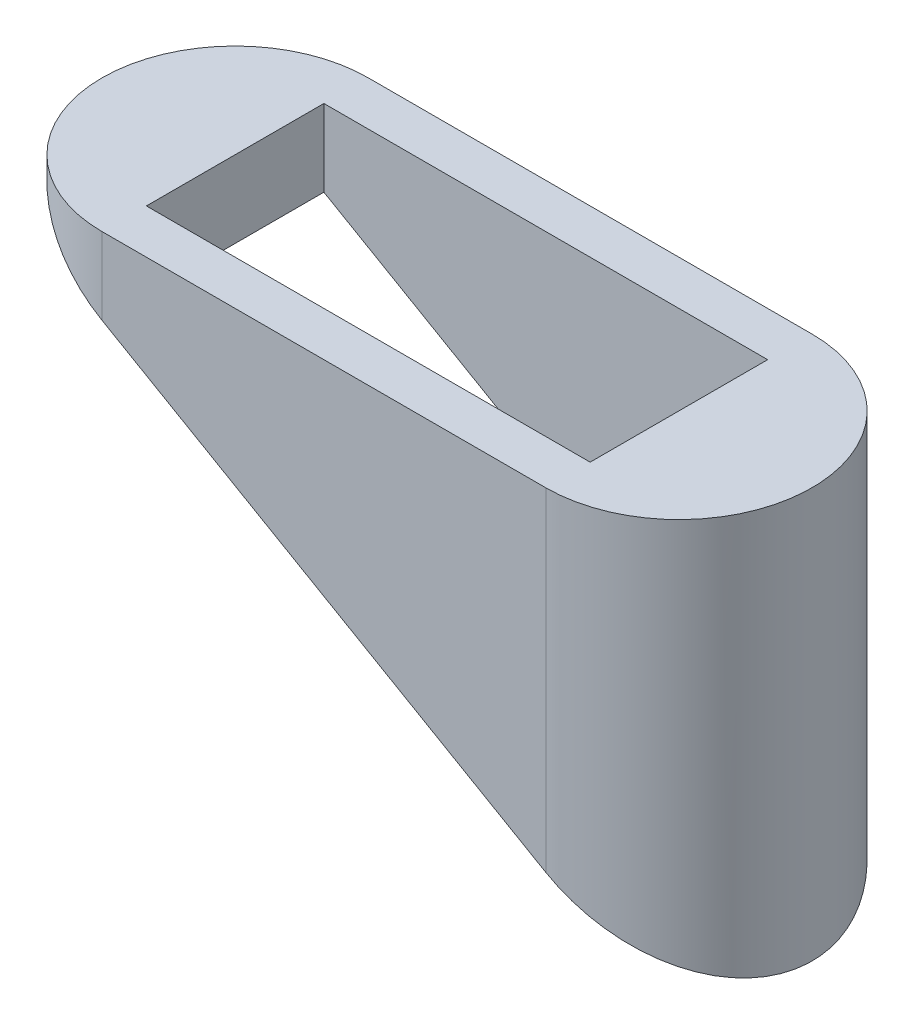
ISO-10303-21;
HEADER;
FILE_DESCRIPTION(('STEP AP214'),'2;1');
FILE_NAME('part.step','',(''),(''),'','','');
FILE_SCHEMA(('AUTOMOTIVE_DESIGN { 1 0 10303 214 1 1 1 1 }'));
ENDSEC;
DATA;
#1=APPLICATION_CONTEXT('core data for automotive mechanical design processes');
#2=APPLICATION_PROTOCOL_DEFINITION('international standard','automotive_design',2000,#1);
#3=PRODUCT_CONTEXT('',#1,'mechanical');
#4=PRODUCT('Part','Part','',(#3));
#5=PRODUCT_RELATED_PRODUCT_CATEGORY('part','',(#4));
#6=PRODUCT_DEFINITION_FORMATION('','',#4);
#7=PRODUCT_DEFINITION_CONTEXT('part definition',#1,'design');
#8=PRODUCT_DEFINITION('design','',#6,#7);
#9=PRODUCT_DEFINITION_SHAPE('','',#8);
#10=(LENGTH_UNIT() NAMED_UNIT(*) SI_UNIT(.MILLI.,.METRE.));
#11=(NAMED_UNIT(*) PLANE_ANGLE_UNIT() SI_UNIT($,.RADIAN.));
#12=(NAMED_UNIT(*) SI_UNIT($,.STERADIAN.) SOLID_ANGLE_UNIT());
#13=UNCERTAINTY_MEASURE_WITH_UNIT(LENGTH_MEASURE(1.E-05),#10,'distance_accuracy_value','');
#14=(GEOMETRIC_REPRESENTATION_CONTEXT(3) GLOBAL_UNCERTAINTY_ASSIGNED_CONTEXT((#13)) GLOBAL_UNIT_ASSIGNED_CONTEXT((#10,
#11,#12)) REPRESENTATION_CONTEXT('',''));
#15=CARTESIAN_POINT('',(0.,0.,0.));
#16=DIRECTION('',(0.,0.,1.));
#17=DIRECTION('',(1.,0.,0.));
#18=AXIS2_PLACEMENT_3D('',#15,#16,#17);
#19=CARTESIAN_POINT('',(0.,-3.,0.));
#20=DIRECTION('',(0.,1.,0.));
#21=DIRECTION('',(0.,0.,1.));
#22=AXIS2_PLACEMENT_3D('',#19,#20,#21);
#23=PLANE('',#22);
#24=CARTESIAN_POINT('',(0.,-3.,0.));
#25=DIRECTION('',(0.,1.,0.));
#26=DIRECTION('',(0.,0.,1.));
#27=AXIS2_PLACEMENT_3D('',#24,#25,#26);
#28=CIRCLE('',#27,7.5);
#29=CARTESIAN_POINT('',(0.,-3.,7.5));
#30=VERTEX_POINT('',#29);
#31=CARTESIAN_POINT('',(0.,-3.,-7.5));
#32=VERTEX_POINT('',#31);
#33=EDGE_CURVE('E187',#30,#32,#28,.T.);
#34=ORIENTED_EDGE('',*,*,#33,.T.);
#35=DIRECTION('',(-1.,0.,0.));
#36=VECTOR('',#35,1.);
#37=CARTESIAN_POINT('',(0.,-3.,-7.5));
#38=LINE('',#37,#36);
#39=CARTESIAN_POINT('',(-25.,-3.,-7.5));
#40=VERTEX_POINT('',#39);
#41=EDGE_CURVE('E133',#32,#40,#38,.T.);
#42=ORIENTED_EDGE('',*,*,#41,.T.);
#43=CARTESIAN_POINT('',(-25.,-3.,0.));
#44=DIRECTION('',(0.,1.,0.));
#45=DIRECTION('',(0.,0.,1.));
#46=AXIS2_PLACEMENT_3D('',#43,#44,#45);
#47=CIRCLE('',#46,7.5);
#48=CARTESIAN_POINT('',(-32.5,-3.,0.));
#49=VERTEX_POINT('',#48);
#50=EDGE_CURVE('E123',#40,#49,#47,.T.);
#51=ORIENTED_EDGE('',*,*,#50,.T.);
#52=CARTESIAN_POINT('',(-25.,-3.,7.5));
#53=VERTEX_POINT('',#52);
#54=EDGE_CURVE('E131',#49,#53,#47,.T.);
#55=ORIENTED_EDGE('',*,*,#54,.T.);
#56=DIRECTION('',(1.,0.,0.));
#57=VECTOR('',#56,1.);
#58=CARTESIAN_POINT('',(0.,-3.,7.5));
#59=LINE('',#58,#57);
#60=EDGE_CURVE('E138',#53,#30,#59,.T.);
#61=ORIENTED_EDGE('',*,*,#60,.T.);
#62=EDGE_LOOP('',(#34,#42,#51,#55,#61));
#63=FACE_BOUND('',#62,.T.);
#64=DIRECTION('',(0.,0.,-1.));
#65=VECTOR('',#64,1.);
#66=CARTESIAN_POINT('',(0.,-3.,5.));
#67=LINE('',#66,#65);
#68=CARTESIAN_POINT('',(0.,-3.,5.));
#69=VERTEX_POINT('',#68);
#70=CARTESIAN_POINT('',(0.,-3.,-5.));
#71=VERTEX_POINT('',#70);
#72=EDGE_CURVE('E185',#69,#71,#67,.T.);
#73=ORIENTED_EDGE('',*,*,#72,.F.);
#74=DIRECTION('',(1.,0.,0.));
#75=VECTOR('',#74,1.);
#76=CARTESIAN_POINT('',(-25.,-3.,5.));
#77=LINE('',#76,#75);
#78=CARTESIAN_POINT('',(-25.,-3.,5.));
#79=VERTEX_POINT('',#78);
#80=EDGE_CURVE('E183',#79,#69,#77,.T.);
#81=ORIENTED_EDGE('',*,*,#80,.F.);
#82=DIRECTION('',(0.,0.,1.));
#83=VECTOR('',#82,1.);
#84=CARTESIAN_POINT('',(-25.,-3.,5.));
#85=LINE('',#84,#83);
#86=CARTESIAN_POINT('',(-25.,-3.,-5.));
#87=VERTEX_POINT('',#86);
#88=EDGE_CURVE('E181',#87,#79,#85,.T.);
#89=ORIENTED_EDGE('',*,*,#88,.F.);
#90=DIRECTION('',(-1.,0.,0.));
#91=VECTOR('',#90,1.);
#92=CARTESIAN_POINT('',(-25.,-3.,-5.));
#93=LINE('',#92,#91);
#94=EDGE_CURVE('E179',#71,#87,#93,.T.);
#95=ORIENTED_EDGE('',*,*,#94,.F.);
#96=EDGE_LOOP('',(#73,#81,#89,#95));
#97=FACE_BOUND('',#96,.T.);
#98=ADVANCED_FACE('F41',(#63,#97),#23,.T.);
#99=CARTESIAN_POINT('',(0.,2.,0.));
#100=DIRECTION('',(0.,-1.,0.));
#101=DIRECTION('',(0.,0.,-1.));
#102=AXIS2_PLACEMENT_3D('',#99,#100,#101);
#103=CYLINDRICAL_SURFACE('',#102,7.5);
#104=ORIENTED_EDGE('',*,*,#33,.F.);
#105=DIRECTION('',(0.,-1.,0.));
#106=VECTOR('',#105,1.);
#107=CARTESIAN_POINT('',(0.,2.,7.5));
#108=LINE('',#107,#106);
#109=CARTESIAN_POINT('',(0.,-21.7638837486627,7.5));
#110=VERTEX_POINT('',#109);
#111=EDGE_CURVE('E151',#30,#110,#108,.T.);
#112=ORIENTED_EDGE('',*,*,#111,.T.);
#113=CARTESIAN_POINT('',(0.,-21.7638837486627,0.));
#114=DIRECTION('',(-0.499999999999998,-0.86602540378444,0.));
#115=DIRECTION('',(0.86602540378444,-0.499999999999998,0.));
#116=AXIS2_PLACEMENT_3D('',#113,#114,#115);
#117=ELLIPSE('',#116,8.66025403784437,7.5);
#118=CARTESIAN_POINT('',(0.,-21.7638837486627,-7.5));
#119=VERTEX_POINT('',#118);
#120=EDGE_CURVE('E119',#119,#110,#117,.T.);
#121=ORIENTED_EDGE('',*,*,#120,.F.);
#122=DIRECTION('',(0.,-1.,0.));
#123=VECTOR('',#122,1.);
#124=CARTESIAN_POINT('',(0.,2.,-7.5));
#125=LINE('',#124,#123);
#126=EDGE_CURVE('E146',#32,#119,#125,.T.);
#127=ORIENTED_EDGE('',*,*,#126,.F.);
#128=EDGE_LOOP('',(#104,#112,#121,#127));
#129=FACE_BOUND('',#128,.T.);
#130=ADVANCED_FACE('F200',(#129),#103,.T.);
#131=CARTESIAN_POINT('',(-25.,-30.,5.));
#132=DIRECTION('',(0.,0.,-1.));
#133=DIRECTION('',(-1.,0.,0.));
#134=AXIS2_PLACEMENT_3D('',#131,#132,#133);
#135=PLANE('',#134);
#136=DIRECTION('',(0.,1.,0.));
#137=VECTOR('',#136,1.);
#138=CARTESIAN_POINT('',(-25.,-30.,5.));
#139=LINE('',#138,#137);
#140=CARTESIAN_POINT('',(-25.,-7.33012701892217,5.));
#141=VERTEX_POINT('',#140);
#142=EDGE_CURVE('E156',#141,#79,#139,.T.);
#143=ORIENTED_EDGE('',*,*,#142,.T.);
#144=ORIENTED_EDGE('',*,*,#80,.T.);
#145=DIRECTION('',(0.,1.,0.));
#146=VECTOR('',#145,1.);
#147=CARTESIAN_POINT('',(0.,-30.,5.));
#148=LINE('',#147,#146);
#149=CARTESIAN_POINT('',(0.,-21.7638837486627,5.));
#150=VERTEX_POINT('',#149);
#151=EDGE_CURVE('E153',#150,#69,#148,.T.);
#152=ORIENTED_EDGE('',*,*,#151,.F.);
#153=DIRECTION('',(-0.86602540378444,0.499999999999998,0.));
#154=VECTOR('',#153,1.);
#155=CARTESIAN_POINT('',(-15.1836570489101,-12.9975952641916,5.));
#156=LINE('',#155,#154);
#157=EDGE_CURVE('E173',#150,#141,#156,.T.);
#158=ORIENTED_EDGE('',*,*,#157,.T.);
#159=EDGE_LOOP('',(#143,#144,#152,#158));
#160=FACE_BOUND('',#159,.T.);
#161=ADVANCED_FACE('F212',(#160),#135,.T.);
#162=CARTESIAN_POINT('',(-9.42403810567658,-16.3229128114971,-7.5));
#163=DIRECTION('',(-0.499999999999998,-0.86602540378444,0.));
#164=DIRECTION('',(0.86602540378444,-0.499999999999998,0.));
#165=AXIS2_PLACEMENT_3D('',#162,#163,#164);
#166=PLANE('',#165);
#167=DIRECTION('',(0.86602540378444,-0.499999999999998,0.));
#168=VECTOR('',#167,1.);
#169=CARTESIAN_POINT('',(-15.1836570489101,-12.9975952641916,-5.));
#170=LINE('',#169,#168);
#171=CARTESIAN_POINT('',(-25.,-7.33012701892217,-5.));
#172=VERTEX_POINT('',#171);
#173=CARTESIAN_POINT('',(0.,-21.7638837486627,-5.));
#174=VERTEX_POINT('',#173);
#175=EDGE_CURVE('E148',#172,#174,#170,.T.);
#176=ORIENTED_EDGE('',*,*,#175,.F.);
#177=DIRECTION('',(0.,0.,-1.));
#178=VECTOR('',#177,1.);
#179=CARTESIAN_POINT('',(-25.,-7.33012701892217,5.));
#180=LINE('',#179,#178);
#181=EDGE_CURVE('E176',#141,#172,#180,.T.);
#182=ORIENTED_EDGE('',*,*,#181,.F.);
#183=ORIENTED_EDGE('',*,*,#157,.F.);
#184=DIRECTION('',(0.,0.,1.));
#185=VECTOR('',#184,1.);
#186=CARTESIAN_POINT('',(0.,-21.7638837486627,5.));
#187=LINE('',#186,#185);
#188=EDGE_CURVE('E124',#174,#150,#187,.T.);
#189=ORIENTED_EDGE('',*,*,#188,.F.);
#190=EDGE_LOOP('',(#176,#182,#183,#189));
#191=FACE_BOUND('',#190,.T.);
#192=ORIENTED_EDGE('',*,*,#120,.T.);
#193=DIRECTION('',(0.86602540378444,-0.499999999999998,0.));
#194=VECTOR('',#193,1.);
#195=CARTESIAN_POINT('',(-9.42403810567658,-16.3229128114971,7.5));
#196=LINE('',#195,#194);
#197=CARTESIAN_POINT('',(-25.,-7.33012701892217,7.5));
#198=VERTEX_POINT('',#197);
#199=EDGE_CURVE('E11',#198,#110,#196,.T.);
#200=ORIENTED_EDGE('',*,*,#199,.F.);
#201=CARTESIAN_POINT('',(-25.,-7.33012701892217,0.));
#202=DIRECTION('',(-0.499999999999998,-0.86602540378444,0.));
#203=DIRECTION('',(0.86602540378444,-0.499999999999998,0.));
#204=AXIS2_PLACEMENT_3D('',#201,#202,#203);
#205=ELLIPSE('',#204,8.66025403784437,7.5);
#206=EDGE_CURVE('E111',#198,#49,#205,.T.);
#207=ORIENTED_EDGE('',*,*,#206,.T.);
#208=CARTESIAN_POINT('',(-25.,-7.33012701892217,-7.5));
#209=VERTEX_POINT('',#208);
#210=EDGE_CURVE('E115',#49,#209,#205,.T.);
#211=ORIENTED_EDGE('',*,*,#210,.T.);
#212=DIRECTION('',(0.86602540378444,-0.499999999999998,0.));
#213=VECTOR('',#212,1.);
#214=CARTESIAN_POINT('',(-9.42403810567658,-16.3229128114971,-7.5));
#215=LINE('',#214,#213);
#216=EDGE_CURVE('E50',#209,#119,#215,.T.);
#217=ORIENTED_EDGE('',*,*,#216,.T.);
#218=EDGE_LOOP('',(#192,#200,#207,#211,#217));
#219=FACE_BOUND('',#218,.T.);
#220=ADVANCED_FACE('F113',(#191,#219),#166,.T.);
#221=CARTESIAN_POINT('',(-25.,-30.,5.));
#222=DIRECTION('',(1.,0.,0.));
#223=DIRECTION('',(0.,0.,-1.));
#224=AXIS2_PLACEMENT_3D('',#221,#222,#223);
#225=PLANE('',#224);
#226=DIRECTION('',(0.,1.,0.));
#227=VECTOR('',#226,1.);
#228=CARTESIAN_POINT('',(-25.,-30.,-5.));
#229=LINE('',#228,#227);
#230=EDGE_CURVE('E158',#172,#87,#229,.T.);
#231=ORIENTED_EDGE('',*,*,#230,.T.);
#232=ORIENTED_EDGE('',*,*,#88,.T.);
#233=ORIENTED_EDGE('',*,*,#142,.F.);
#234=ORIENTED_EDGE('',*,*,#181,.T.);
#235=EDGE_LOOP('',(#231,#232,#233,#234));
#236=FACE_BOUND('',#235,.T.);
#237=ADVANCED_FACE('F257',(#236),#225,.T.);
#238=CARTESIAN_POINT('',(0.,-30.,5.));
#239=DIRECTION('',(-1.,0.,0.));
#240=DIRECTION('',(0.,0.,1.));
#241=AXIS2_PLACEMENT_3D('',#238,#239,#240);
#242=PLANE('',#241);
#243=ORIENTED_EDGE('',*,*,#151,.T.);
#244=ORIENTED_EDGE('',*,*,#72,.T.);
#245=DIRECTION('',(0.,1.,0.));
#246=VECTOR('',#245,1.);
#247=CARTESIAN_POINT('',(0.,-30.,-5.));
#248=LINE('',#247,#246);
#249=EDGE_CURVE('E45',#174,#71,#248,.T.);
#250=ORIENTED_EDGE('',*,*,#249,.F.);
#251=ORIENTED_EDGE('',*,*,#188,.T.);
#252=EDGE_LOOP('',(#243,#244,#250,#251));
#253=FACE_BOUND('',#252,.T.);
#254=ADVANCED_FACE('F249',(#253),#242,.T.);
#255=CARTESIAN_POINT('',(-25.,-30.,-5.));
#256=DIRECTION('',(0.,0.,1.));
#257=DIRECTION('',(1.,0.,0.));
#258=AXIS2_PLACEMENT_3D('',#255,#256,#257);
#259=PLANE('',#258);
#260=ORIENTED_EDGE('',*,*,#249,.T.);
#261=ORIENTED_EDGE('',*,*,#94,.T.);
#262=ORIENTED_EDGE('',*,*,#230,.F.);
#263=ORIENTED_EDGE('',*,*,#175,.T.);
#264=EDGE_LOOP('',(#260,#261,#262,#263));
#265=FACE_BOUND('',#264,.T.);
#266=ADVANCED_FACE('F43',(#265),#259,.T.);
#267=CARTESIAN_POINT('',(-25.,2.,0.));
#268=DIRECTION('',(0.,-1.,0.));
#269=DIRECTION('',(0.,0.,-1.));
#270=AXIS2_PLACEMENT_3D('',#267,#268,#269);
#271=CYLINDRICAL_SURFACE('',#270,7.5);
#272=ORIENTED_EDGE('',*,*,#54,.F.);
#273=ORIENTED_EDGE('',*,*,#206,.F.);
#274=DIRECTION('',(0.,-1.,0.));
#275=VECTOR('',#274,1.);
#276=CARTESIAN_POINT('',(-25.,2.,7.5));
#277=LINE('',#276,#275);
#278=EDGE_CURVE('E57',#53,#198,#277,.T.);
#279=ORIENTED_EDGE('',*,*,#278,.F.);
#280=EDGE_LOOP('',(#272,#273,#279));
#281=FACE_BOUND('',#280,.T.);
#282=ADVANCED_FACE('F136',(#281),#271,.T.);
#283=CARTESIAN_POINT('',(0.,2.,7.5));
#284=DIRECTION('',(0.,0.,-1.));
#285=DIRECTION('',(-1.,0.,0.));
#286=AXIS2_PLACEMENT_3D('',#283,#284,#285);
#287=PLANE('',#286);
#288=ORIENTED_EDGE('',*,*,#60,.F.);
#289=ORIENTED_EDGE('',*,*,#278,.T.);
#290=ORIENTED_EDGE('',*,*,#199,.T.);
#291=ORIENTED_EDGE('',*,*,#111,.F.);
#292=EDGE_LOOP('',(#288,#289,#290,#291));
#293=FACE_BOUND('',#292,.T.);
#294=ADVANCED_FACE('F201',(#293),#287,.F.);
#295=CARTESIAN_POINT('',(0.,2.,-7.5));
#296=DIRECTION('',(0.,0.,1.));
#297=DIRECTION('',(1.,0.,0.));
#298=AXIS2_PLACEMENT_3D('',#295,#296,#297);
#299=PLANE('',#298);
#300=ORIENTED_EDGE('',*,*,#41,.F.);
#301=ORIENTED_EDGE('',*,*,#126,.T.);
#302=ORIENTED_EDGE('',*,*,#216,.F.);
#303=DIRECTION('',(0.,-1.,0.));
#304=VECTOR('',#303,1.);
#305=CARTESIAN_POINT('',(-25.,2.,-7.5));
#306=LINE('',#305,#304);
#307=EDGE_CURVE('E65',#40,#209,#306,.T.);
#308=ORIENTED_EDGE('',*,*,#307,.F.);
#309=EDGE_LOOP('',(#300,#301,#302,#308));
#310=FACE_BOUND('',#309,.T.);
#311=ADVANCED_FACE('F199',(#310),#299,.F.);
#312=ORIENTED_EDGE('',*,*,#50,.F.);
#313=ORIENTED_EDGE('',*,*,#307,.T.);
#314=ORIENTED_EDGE('',*,*,#210,.F.);
#315=EDGE_LOOP('',(#312,#313,#314));
#316=FACE_BOUND('',#315,.T.);
#317=ADVANCED_FACE('F122',(#316),#271,.T.);
#318=CLOSED_SHELL('',(#98,#130,#161,#220,#237,#254,#266,#282,#294,#311,#317));
#319=MANIFOLD_SOLID_BREP('B2',#318);
#320=ADVANCED_BREP_SHAPE_REPRESENTATION('',(#18,#319),#14);
#321=SHAPE_DEFINITION_REPRESENTATION(#9,#320);
ENDSEC;
END-ISO-10303-21;
